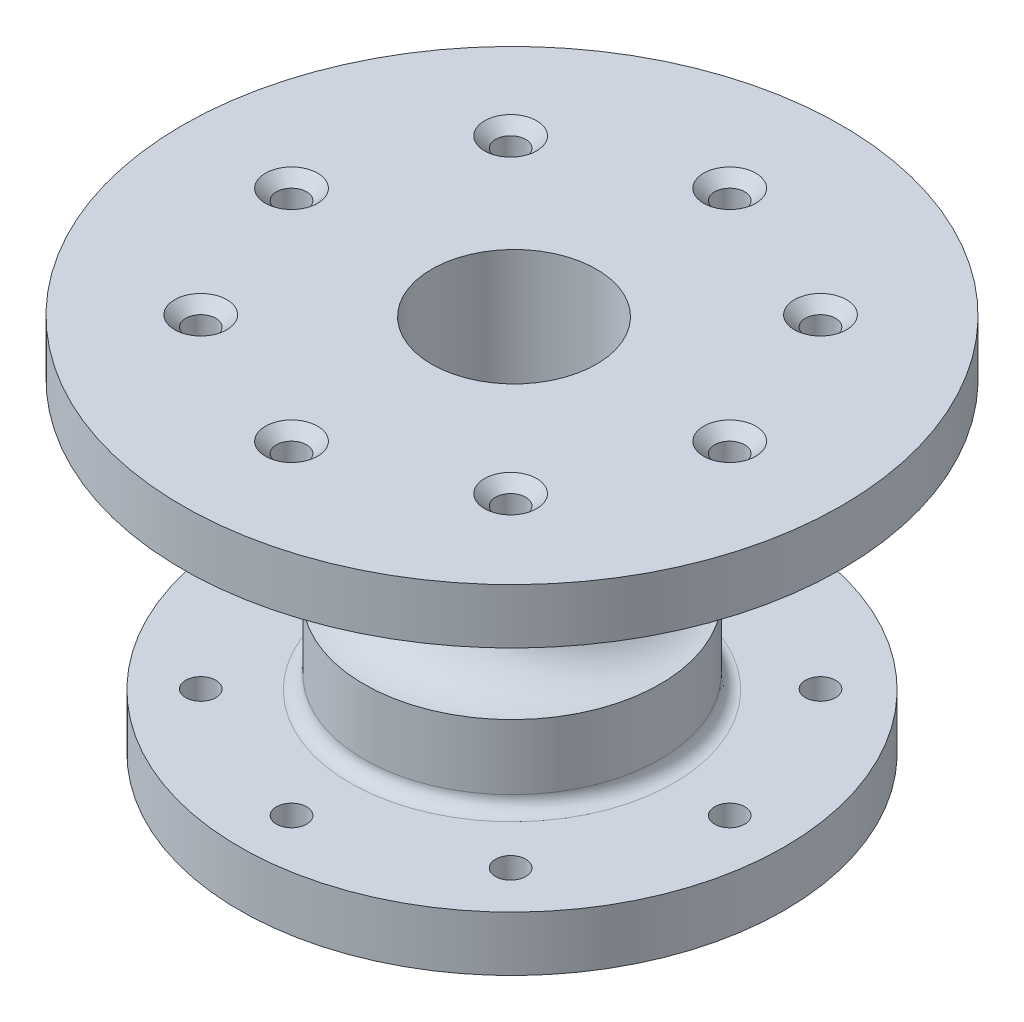
ISO-10303-21;
HEADER;
FILE_DESCRIPTION(('STEP AP214'),'2;1');
FILE_NAME('part.step','',(''),(''),'','','');
FILE_SCHEMA(('AUTOMOTIVE_DESIGN { 1 0 10303 214 1 1 1 1 }'));
ENDSEC;
DATA;
#1=APPLICATION_CONTEXT('core data for automotive mechanical design processes');
#2=APPLICATION_PROTOCOL_DEFINITION('international standard','automotive_design',2000,#1);
#3=PRODUCT_CONTEXT('',#1,'mechanical');
#4=PRODUCT('Part','Part','',(#3));
#5=PRODUCT_RELATED_PRODUCT_CATEGORY('part','',(#4));
#6=PRODUCT_DEFINITION_FORMATION('','',#4);
#7=PRODUCT_DEFINITION_CONTEXT('part definition',#1,'design');
#8=PRODUCT_DEFINITION('design','',#6,#7);
#9=PRODUCT_DEFINITION_SHAPE('','',#8);
#10=(LENGTH_UNIT() NAMED_UNIT(*) SI_UNIT(.MILLI.,.METRE.));
#11=(NAMED_UNIT(*) PLANE_ANGLE_UNIT() SI_UNIT($,.RADIAN.));
#12=(NAMED_UNIT(*) SI_UNIT($,.STERADIAN.) SOLID_ANGLE_UNIT());
#13=UNCERTAINTY_MEASURE_WITH_UNIT(LENGTH_MEASURE(1.E-05),#10,'distance_accuracy_value','');
#14=(GEOMETRIC_REPRESENTATION_CONTEXT(3) GLOBAL_UNCERTAINTY_ASSIGNED_CONTEXT((#13)) GLOBAL_UNIT_ASSIGNED_CONTEXT((#10,
#11,#12)) REPRESENTATION_CONTEXT('',''));
#15=CARTESIAN_POINT('',(0.,0.,0.));
#16=DIRECTION('',(0.,0.,1.));
#17=DIRECTION('',(1.,0.,0.));
#18=AXIS2_PLACEMENT_3D('',#15,#16,#17);
#19=CARTESIAN_POINT('',(-0.742985442059328,-44.003557410466,0.));
#20=DIRECTION('',(0.,1.,0.));
#21=DIRECTION('',(-1.,0.,0.));
#22=AXIS2_PLACEMENT_3D('',#19,#20,#21);
#23=TOROIDAL_SURFACE('',#22,58.8888888888888,5.);
#24=CARTESIAN_POINT('',(-0.742985442059325,-44.003557410466,0.));
#25=DIRECTION('',(0.,1.,0.));
#26=DIRECTION('',(-1.,0.,0.));
#27=AXIS2_PLACEMENT_3D('',#24,#25,#26);
#28=CIRCLE('',#27,53.8888888888889);
#29=CARTESIAN_POINT('',(-54.6318743309482,-44.003557410466,0.));
#30=VERTEX_POINT('',#29);
#31=EDGE_CURVE('E10',#30,#30,#28,.T.);
#32=ORIENTED_EDGE('',*,*,#31,.F.);
#33=EDGE_LOOP('',(#32));
#34=FACE_BOUND('',#33,.T.);
#35=CARTESIAN_POINT('',(-0.742985442059325,-49.003557410466,0.));
#36=DIRECTION('',(0.,1.,0.));
#37=DIRECTION('',(-1.,0.,0.));
#38=AXIS2_PLACEMENT_3D('',#35,#36,#37);
#39=CIRCLE('',#38,58.8888888888888);
#40=CARTESIAN_POINT('',(-59.6318743309482,-49.003557410466,0.));
#41=VERTEX_POINT('',#40);
#42=EDGE_CURVE('E90',#41,#41,#39,.T.);
#43=ORIENTED_EDGE('',*,*,#42,.T.);
#44=EDGE_LOOP('',(#43));
#45=FACE_BOUND('',#44,.T.);
#46=ADVANCED_FACE('F47',(#34,#45),#23,.F.);
#47=CARTESIAN_POINT('',(-0.742985442059307,69.003557410466,0.));
#48=DIRECTION('',(0.,1.,0.));
#49=DIRECTION('',(-1.,0.,0.));
#50=AXIS2_PLACEMENT_3D('',#47,#48,#49);
#51=CYLINDRICAL_SURFACE('',#50,53.8888888888889);
#52=CARTESIAN_POINT('',(-0.742985442059321,-20.3214611920219,0.));
#53=DIRECTION('',(0.,1.,0.));
#54=DIRECTION('',(-1.,0.,0.));
#55=AXIS2_PLACEMENT_3D('',#52,#53,#54);
#56=CIRCLE('',#55,53.8888888888889);
#57=CARTESIAN_POINT('',(-54.6318743309482,-20.3214611920219,0.));
#58=VERTEX_POINT('',#57);
#59=EDGE_CURVE('E54',#58,#58,#56,.T.);
#60=ORIENTED_EDGE('',*,*,#59,.F.);
#61=EDGE_LOOP('',(#60));
#62=FACE_BOUND('',#61,.T.);
#63=ORIENTED_EDGE('',*,*,#31,.T.);
#64=EDGE_LOOP('',(#63));
#65=FACE_BOUND('',#64,.T.);
#66=ADVANCED_FACE('F322',(#62,#65),#51,.T.);
#67=CARTESIAN_POINT('',(-0.742985442059321,-0.321461192021893,0.));
#68=DIRECTION('',(0.,1.,0.));
#69=DIRECTION('',(-1.,0.,0.));
#70=AXIS2_PLACEMENT_3D('',#67,#68,#69);
#71=TOROIDAL_SURFACE('',#70,53.8888888888889,20.);
#72=CARTESIAN_POINT('',(-0.742985442059315,19.6785388079781,0.));
#73=DIRECTION('',(0.,1.,0.));
#74=DIRECTION('',(-1.,0.,0.));
#75=AXIS2_PLACEMENT_3D('',#72,#73,#74);
#76=CIRCLE('',#75,53.8888888888889);
#77=CARTESIAN_POINT('',(-54.6318743309482,19.6785388079781,0.));
#78=VERTEX_POINT('',#77);
#79=EDGE_CURVE('E59',#78,#78,#76,.T.);
#80=ORIENTED_EDGE('',*,*,#79,.F.);
#81=EDGE_LOOP('',(#80));
#82=FACE_BOUND('',#81,.T.);
#83=ORIENTED_EDGE('',*,*,#59,.T.);
#84=EDGE_LOOP('',(#83));
#85=FACE_BOUND('',#84,.T.);
#86=ADVANCED_FACE('F317',(#82,#85),#71,.F.);
#87=CARTESIAN_POINT('',(-0.742985442059307,69.003557410466,0.));
#88=DIRECTION('',(0.,1.,0.));
#89=DIRECTION('',(-1.,0.,0.));
#90=AXIS2_PLACEMENT_3D('',#87,#88,#89);
#91=CYLINDRICAL_SURFACE('',#90,53.8888888888888);
#92=CARTESIAN_POINT('',(-0.742985442059311,44.003557410466,0.));
#93=DIRECTION('',(0.,1.,0.));
#94=DIRECTION('',(-1.,0.,0.));
#95=AXIS2_PLACEMENT_3D('',#92,#93,#94);
#96=CIRCLE('',#95,53.8888888888888);
#97=CARTESIAN_POINT('',(-54.6318743309482,44.0035574104661,0.));
#98=VERTEX_POINT('',#97);
#99=EDGE_CURVE('E64',#98,#98,#96,.T.);
#100=ORIENTED_EDGE('',*,*,#99,.F.);
#101=EDGE_LOOP('',(#100));
#102=FACE_BOUND('',#101,.T.);
#103=ORIENTED_EDGE('',*,*,#79,.T.);
#104=EDGE_LOOP('',(#103));
#105=FACE_BOUND('',#104,.T.);
#106=ADVANCED_FACE('F311',(#102,#105),#91,.T.);
#107=CARTESIAN_POINT('',(-0.742985442059314,44.0035574104661,0.));
#108=DIRECTION('',(0.,1.,0.));
#109=DIRECTION('',(-1.,0.,0.));
#110=AXIS2_PLACEMENT_3D('',#107,#108,#109);
#111=TOROIDAL_SURFACE('',#110,58.8888888888888,5.);
#112=CARTESIAN_POINT('',(-0.74298544205931,49.0035574104661,0.));
#113=DIRECTION('',(0.,1.,0.));
#114=DIRECTION('',(-1.,0.,0.));
#115=AXIS2_PLACEMENT_3D('',#112,#113,#114);
#116=CIRCLE('',#115,58.8888888888888);
#117=CARTESIAN_POINT('',(-59.6318743309481,49.0035574104661,0.));
#118=VERTEX_POINT('',#117);
#119=EDGE_CURVE('E70',#118,#118,#116,.T.);
#120=ORIENTED_EDGE('',*,*,#119,.F.);
#121=EDGE_LOOP('',(#120));
#122=FACE_BOUND('',#121,.T.);
#123=ORIENTED_EDGE('',*,*,#99,.T.);
#124=EDGE_LOOP('',(#123));
#125=FACE_BOUND('',#124,.T.);
#126=ADVANCED_FACE('F304',(#122,#125),#111,.F.);
#127=CARTESIAN_POINT('',(119.257014557941,49.003557410466,0.));
#128=DIRECTION('',(0.,1.,0.));
#129=DIRECTION('',(-1.,0.,0.));
#130=AXIS2_PLACEMENT_3D('',#127,#128,#129);
#131=PLANE('',#130);
#132=CARTESIAN_POINT('',(-1.24297699976672,49.0035574104661,-79.7770463266747));
#133=DIRECTION('',(0.,1.,0.));
#134=DIRECTION('',(0.,0.,1.));
#135=AXIS2_PLACEMENT_3D('',#132,#133,#134);
#136=CIRCLE('',#135,5.49999999999998);
#137=CARTESIAN_POINT('',(-1.2429769997667,49.0035574104661,-74.2770463266747));
#138=VERTEX_POINT('',#137);
#139=EDGE_CURVE('E168',#138,#138,#136,.T.);
#140=ORIENTED_EDGE('',*,*,#139,.T.);
#141=EDGE_LOOP('',(#140));
#142=FACE_BOUND('',#141,.T.);
#143=CARTESIAN_POINT('',(-57.6538674403918,49.0035574104661,-56.4108904406247));
#144=DIRECTION('',(0.,1.,0.));
#145=DIRECTION('',(0.707106781186551,0.,0.707106781186544));
#146=AXIS2_PLACEMENT_3D('',#143,#144,#145);
#147=CIRCLE('',#146,5.49999999999998);
#148=CARTESIAN_POINT('',(-53.7647801438658,49.0035574104661,-52.5218031440988));
#149=VERTEX_POINT('',#148);
#150=EDGE_CURVE('E158',#149,#149,#147,.T.);
#151=ORIENTED_EDGE('',*,*,#150,.T.);
#152=EDGE_LOOP('',(#151));
#153=FACE_BOUND('',#152,.T.);
#154=CARTESIAN_POINT('',(-81.0200233264412,49.0035574104661,0.));
#155=DIRECTION('',(0.,1.,0.));
#156=DIRECTION('',(1.,0.,0.));
#157=AXIS2_PLACEMENT_3D('',#154,#155,#156);
#158=CIRCLE('',#157,5.49999999999998);
#159=CARTESIAN_POINT('',(-75.5200233264412,49.0035574104661,0.));
#160=VERTEX_POINT('',#159);
#161=EDGE_CURVE('E146',#160,#160,#158,.T.);
#162=ORIENTED_EDGE('',*,*,#161,.T.);
#163=EDGE_LOOP('',(#162));
#164=FACE_BOUND('',#163,.T.);
#165=CARTESIAN_POINT('',(-57.653867440391,49.0035574104661,56.4108904406255));
#166=DIRECTION('',(0.,1.,0.));
#167=DIRECTION('',(0.707106781186541,0.,-0.707106781186554));
#168=AXIS2_PLACEMENT_3D('',#165,#166,#167);
#169=CIRCLE('',#168,5.49999999999998);
#170=CARTESIAN_POINT('',(-53.764780143865,49.0035574104661,52.5218031440995));
#171=VERTEX_POINT('',#170);
#172=EDGE_CURVE('E132',#171,#171,#169,.T.);
#173=ORIENTED_EDGE('',*,*,#172,.T.);
#174=EDGE_LOOP('',(#173));
#175=FACE_BOUND('',#174,.T.);
#176=CARTESIAN_POINT('',(-1.24297699976561,49.0035574104661,79.7770463266747));
#177=DIRECTION('',(0.,1.,0.));
#178=DIRECTION('',(0.,0.,-1.));
#179=AXIS2_PLACEMENT_3D('',#176,#177,#178);
#180=CIRCLE('',#179,5.49999999999998);
#181=CARTESIAN_POINT('',(-1.24297699976567,49.0035574104661,74.2770463266747));
#182=VERTEX_POINT('',#181);
#183=EDGE_CURVE('E192',#182,#182,#180,.T.);
#184=ORIENTED_EDGE('',*,*,#183,.T.);
#185=EDGE_LOOP('',(#184));
#186=FACE_BOUND('',#185,.T.);
#187=CARTESIAN_POINT('',(55.1679134408593,49.003557410466,56.4108904406244));
#188=DIRECTION('',(0.,1.,0.));
#189=DIRECTION('',(-0.707106781186556,0.,-0.707106781186539));
#190=AXIS2_PLACEMENT_3D('',#187,#188,#189);
#191=CIRCLE('',#190,5.49999999999998);
#192=CARTESIAN_POINT('',(51.2788261443332,49.003557410466,52.5218031440984));
#193=VERTEX_POINT('',#192);
#194=EDGE_CURVE('E180',#193,#193,#191,.T.);
#195=ORIENTED_EDGE('',*,*,#194,.T.);
#196=EDGE_LOOP('',(#195));
#197=FACE_BOUND('',#196,.T.);
#198=CARTESIAN_POINT('',(55.1679134408585,49.003557410466,-56.4108904406251));
#199=DIRECTION('',(0.,1.,0.));
#200=DIRECTION('',(-0.707106781186546,0.,0.707106781186549));
#201=AXIS2_PLACEMENT_3D('',#198,#199,#200);
#202=CIRCLE('',#201,5.49999999999998);
#203=CARTESIAN_POINT('',(51.2788261443325,49.003557410466,-52.5218031440991));
#204=VERTEX_POINT('',#203);
#205=EDGE_CURVE('E118',#204,#204,#202,.T.);
#206=ORIENTED_EDGE('',*,*,#205,.T.);
#207=EDGE_LOOP('',(#206));
#208=FACE_BOUND('',#207,.T.);
#209=CARTESIAN_POINT('',(78.5340693269083,49.003557410466,0.));
#210=DIRECTION('',(0.,1.,0.));
#211=DIRECTION('',(-1.,0.,0.));
#212=AXIS2_PLACEMENT_3D('',#209,#210,#211);
#213=CIRCLE('',#212,5.49999999999998);
#214=CARTESIAN_POINT('',(73.0340693269083,49.003557410466,0.));
#215=VERTEX_POINT('',#214);
#216=EDGE_CURVE('E94',#215,#215,#213,.T.);
#217=ORIENTED_EDGE('',*,*,#216,.T.);
#218=EDGE_LOOP('',(#217));
#219=FACE_BOUND('',#218,.T.);
#220=CARTESIAN_POINT('',(-0.74298544205931,49.0035574104661,0.));
#221=DIRECTION('',(0.,1.,0.));
#222=DIRECTION('',(-1.,0.,0.));
#223=AXIS2_PLACEMENT_3D('',#220,#221,#222);
#224=CIRCLE('',#223,120.);
#225=CARTESIAN_POINT('',(-120.742985442059,49.0035574104661,0.));
#226=VERTEX_POINT('',#225);
#227=EDGE_CURVE('E74',#226,#226,#224,.T.);
#228=ORIENTED_EDGE('',*,*,#227,.F.);
#229=EDGE_LOOP('',(#228));
#230=FACE_BOUND('',#229,.T.);
#231=ORIENTED_EDGE('',*,*,#119,.T.);
#232=EDGE_LOOP('',(#231));
#233=FACE_BOUND('',#232,.T.);
#234=ADVANCED_FACE('F298',(#142,#153,#164,#175,#186,#197,#208,#219,#230,#233),#131,.F.);
#235=CARTESIAN_POINT('',(-0.742985442059307,69.003557410466,0.));
#236=DIRECTION('',(0.,1.,0.));
#237=DIRECTION('',(-1.,0.,0.));
#238=AXIS2_PLACEMENT_3D('',#235,#236,#237);
#239=CYLINDRICAL_SURFACE('',#238,120.);
#240=CARTESIAN_POINT('',(-0.742985442059307,69.0035574104661,0.));
#241=DIRECTION('',(0.,1.,0.));
#242=DIRECTION('',(-1.,0.,0.));
#243=AXIS2_PLACEMENT_3D('',#240,#241,#242);
#244=CIRCLE('',#243,120.);
#245=CARTESIAN_POINT('',(-120.742985442059,69.0035574104661,0.));
#246=VERTEX_POINT('',#245);
#247=EDGE_CURVE('E78',#246,#246,#244,.T.);
#248=ORIENTED_EDGE('',*,*,#247,.F.);
#249=EDGE_LOOP('',(#248));
#250=FACE_BOUND('',#249,.T.);
#251=ORIENTED_EDGE('',*,*,#227,.T.);
#252=EDGE_LOOP('',(#251));
#253=FACE_BOUND('',#252,.T.);
#254=ADVANCED_FACE('F276',(#250,#253),#239,.T.);
#255=CARTESIAN_POINT('',(-0.742985442059307,69.0035574104661,0.));
#256=DIRECTION('',(0.,-1.,0.));
#257=DIRECTION('',(1.,0.,0.));
#258=AXIS2_PLACEMENT_3D('',#255,#256,#257);
#259=PLANE('',#258);
#260=CARTESIAN_POINT('',(0.,69.0035574104661,0.));
#261=DIRECTION('',(0.,1.,0.));
#262=DIRECTION('',(0.,0.,1.));
#263=AXIS2_PLACEMENT_3D('',#260,#261,#262);
#264=CIRCLE('',#263,30.);
#265=CARTESIAN_POINT('',(0.,69.0035574104661,30.));
#266=VERTEX_POINT('',#265);
#267=EDGE_CURVE('E255',#266,#266,#264,.T.);
#268=ORIENTED_EDGE('',*,*,#267,.F.);
#269=EDGE_LOOP('',(#268));
#270=FACE_BOUND('',#269,.T.);
#271=CARTESIAN_POINT('',(-1.24297699976672,69.0035574104661,-79.7770463266747));
#272=DIRECTION('',(0.,1.,0.));
#273=DIRECTION('',(1.,0.,0.));
#274=AXIS2_PLACEMENT_3D('',#271,#272,#273);
#275=CIRCLE('',#274,9.49999999999999);
#276=CARTESIAN_POINT('',(8.25702300023327,69.0035574104661,-79.7770463266747));
#277=VERTEX_POINT('',#276);
#278=EDGE_CURVE('E157',#277,#277,#275,.T.);
#279=ORIENTED_EDGE('',*,*,#278,.F.);
#280=EDGE_LOOP('',(#279));
#281=FACE_BOUND('',#280,.T.);
#282=CARTESIAN_POINT('',(-57.6538674403918,69.0035574104661,-56.4108904406247));
#283=DIRECTION('',(0.,1.,0.));
#284=DIRECTION('',(0.707106781186544,0.,-0.707106781186551));
#285=AXIS2_PLACEMENT_3D('',#282,#283,#284);
#286=CIRCLE('',#285,9.49999999999999);
#287=CARTESIAN_POINT('',(-50.9363530191196,69.0035574104661,-63.128404861897));
#288=VERTEX_POINT('',#287);
#289=EDGE_CURVE('E145',#288,#288,#286,.T.);
#290=ORIENTED_EDGE('',*,*,#289,.F.);
#291=EDGE_LOOP('',(#290));
#292=FACE_BOUND('',#291,.T.);
#293=CARTESIAN_POINT('',(-81.0200233264411,69.0035574104661,0.));
#294=DIRECTION('',(0.,1.,0.));
#295=DIRECTION('',(0.,0.,-1.));
#296=AXIS2_PLACEMENT_3D('',#293,#294,#295);
#297=CIRCLE('',#296,9.49999999999999);
#298=CARTESIAN_POINT('',(-81.0200233264411,69.0035574104661,-9.49999999999999));
#299=VERTEX_POINT('',#298);
#300=EDGE_CURVE('E131',#299,#299,#297,.T.);
#301=ORIENTED_EDGE('',*,*,#300,.F.);
#302=EDGE_LOOP('',(#301));
#303=FACE_BOUND('',#302,.T.);
#304=CARTESIAN_POINT('',(-57.653867440391,69.0035574104661,56.4108904406255));
#305=DIRECTION('',(0.,1.,0.));
#306=DIRECTION('',(-0.707106781186554,0.,-0.707106781186541));
#307=AXIS2_PLACEMENT_3D('',#304,#305,#306);
#308=CIRCLE('',#307,9.49999999999999);
#309=CARTESIAN_POINT('',(-64.3713818616633,69.0035574104661,49.6933760193534));
#310=VERTEX_POINT('',#309);
#311=EDGE_CURVE('E136',#310,#310,#308,.T.);
#312=ORIENTED_EDGE('',*,*,#311,.F.);
#313=EDGE_LOOP('',(#312));
#314=FACE_BOUND('',#313,.T.);
#315=CARTESIAN_POINT('',(-1.24297699976561,69.0035574104661,79.7770463266747));
#316=DIRECTION('',(0.,1.,0.));
#317=DIRECTION('',(-1.,0.,0.));
#318=AXIS2_PLACEMENT_3D('',#315,#316,#317);
#319=CIRCLE('',#318,9.49999999999999);
#320=CARTESIAN_POINT('',(-10.7429769997656,69.0035574104661,79.7770463266748));
#321=VERTEX_POINT('',#320);
#322=EDGE_CURVE('E179',#321,#321,#319,.T.);
#323=ORIENTED_EDGE('',*,*,#322,.F.);
#324=EDGE_LOOP('',(#323));
#325=FACE_BOUND('',#324,.T.);
#326=CARTESIAN_POINT('',(55.1679134408593,69.0035574104661,56.4108904406244));
#327=DIRECTION('',(0.,1.,0.));
#328=DIRECTION('',(-0.707106781186539,0.,0.707106781186556));
#329=AXIS2_PLACEMENT_3D('',#326,#327,#328);
#330=CIRCLE('',#329,9.49999999999999);
#331=CARTESIAN_POINT('',(48.4503990195872,69.0035574104661,63.1284048618966));
#332=VERTEX_POINT('',#331);
#333=EDGE_CURVE('E184',#332,#332,#330,.T.);
#334=ORIENTED_EDGE('',*,*,#333,.F.);
#335=EDGE_LOOP('',(#334));
#336=FACE_BOUND('',#335,.T.);
#337=CARTESIAN_POINT('',(55.1679134408585,69.0035574104661,-56.4108904406251));
#338=DIRECTION('',(0.,1.,0.));
#339=DIRECTION('',(0.707106781186549,0.,0.707106781186546));
#340=AXIS2_PLACEMENT_3D('',#337,#338,#339);
#341=CIRCLE('',#340,9.49999999999999);
#342=CARTESIAN_POINT('',(61.8854278621307,69.0035574104661,-49.693376019353));
#343=VERTEX_POINT('',#342);
#344=EDGE_CURVE('E122',#343,#343,#341,.T.);
#345=ORIENTED_EDGE('',*,*,#344,.F.);
#346=EDGE_LOOP('',(#345));
#347=FACE_BOUND('',#346,.T.);
#348=CARTESIAN_POINT('',(78.5340693269083,69.0035574104661,0.));
#349=DIRECTION('',(0.,1.,0.));
#350=DIRECTION('',(0.,0.,1.));
#351=AXIS2_PLACEMENT_3D('',#348,#349,#350);
#352=CIRCLE('',#351,9.49999999999999);
#353=CARTESIAN_POINT('',(78.5340693269083,69.0035574104661,9.49999999999999));
#354=VERTEX_POINT('',#353);
#355=EDGE_CURVE('E110',#354,#354,#352,.T.);
#356=ORIENTED_EDGE('',*,*,#355,.F.);
#357=EDGE_LOOP('',(#356));
#358=FACE_BOUND('',#357,.T.);
#359=ORIENTED_EDGE('',*,*,#247,.T.);
#360=EDGE_LOOP('',(#359));
#361=FACE_BOUND('',#360,.T.);
#362=ADVANCED_FACE('F272',(#270,#281,#292,#303,#314,#325,#336,#347,#358,#361),#259,.F.);
#363=CARTESIAN_POINT('',(98.4236812246073,-69.0035574104661,0.));
#364=DIRECTION('',(0.,1.,0.));
#365=DIRECTION('',(-1.,0.,0.));
#366=AXIS2_PLACEMENT_3D('',#363,#364,#365);
#367=PLANE('',#366);
#368=CARTESIAN_POINT('',(-1.24297699976674,-69.003557410466,-79.7770463266747));
#369=DIRECTION('',(0.,1.,0.));
#370=DIRECTION('',(1.,0.,0.));
#371=AXIS2_PLACEMENT_3D('',#368,#369,#370);
#372=CIRCLE('',#371,5.49999999999996);
#373=CARTESIAN_POINT('',(4.25702300023322,-69.003557410466,-79.7770463266748));
#374=VERTEX_POINT('',#373);
#375=EDGE_CURVE('E229',#374,#374,#372,.T.);
#376=ORIENTED_EDGE('',*,*,#375,.T.);
#377=EDGE_LOOP('',(#376));
#378=FACE_BOUND('',#377,.T.);
#379=CARTESIAN_POINT('',(-57.6538674403918,-69.003557410466,-56.4108904406248));
#380=DIRECTION('',(0.,1.,0.));
#381=DIRECTION('',(0.707106781186544,0.,-0.707106781186551));
#382=AXIS2_PLACEMENT_3D('',#379,#380,#381);
#383=CIRCLE('',#382,5.49999999999996);
#384=CARTESIAN_POINT('',(-53.7647801438659,-69.003557410466,-60.2999777371508));
#385=VERTEX_POINT('',#384);
#386=EDGE_CURVE('E221',#385,#385,#383,.T.);
#387=ORIENTED_EDGE('',*,*,#386,.T.);
#388=EDGE_LOOP('',(#387));
#389=FACE_BOUND('',#388,.T.);
#390=CARTESIAN_POINT('',(-81.0200233264412,-69.003557410466,0.));
#391=DIRECTION('',(0.,1.,0.));
#392=DIRECTION('',(0.,0.,-1.));
#393=AXIS2_PLACEMENT_3D('',#390,#391,#392);
#394=CIRCLE('',#393,5.49999999999996);
#395=CARTESIAN_POINT('',(-81.0200233264412,-69.003557410466,-5.49999999999996));
#396=VERTEX_POINT('',#395);
#397=EDGE_CURVE('E211',#396,#396,#394,.T.);
#398=ORIENTED_EDGE('',*,*,#397,.T.);
#399=EDGE_LOOP('',(#398));
#400=FACE_BOUND('',#399,.T.);
#401=CARTESIAN_POINT('',(-57.653867440391,-69.003557410466,56.4108904406256));
#402=DIRECTION('',(0.,1.,0.));
#403=DIRECTION('',(-0.707106781186554,0.,-0.707106781186541));
#404=AXIS2_PLACEMENT_3D('',#401,#402,#403);
#405=CIRCLE('',#404,5.49999999999996);
#406=CARTESIAN_POINT('',(-61.5429547369171,-69.003557410466,52.5218031440996));
#407=VERTEX_POINT('',#406);
#408=EDGE_CURVE('E212',#407,#407,#405,.T.);
#409=ORIENTED_EDGE('',*,*,#408,.T.);
#410=EDGE_LOOP('',(#409));
#411=FACE_BOUND('',#410,.T.);
#412=CARTESIAN_POINT('',(-1.24297699976563,-69.003557410466,79.7770463266747));
#413=DIRECTION('',(0.,1.,0.));
#414=DIRECTION('',(-1.,0.,0.));
#415=AXIS2_PLACEMENT_3D('',#412,#413,#414);
#416=CIRCLE('',#415,5.49999999999996);
#417=CARTESIAN_POINT('',(-6.74297699976559,-69.003557410466,79.7770463266748));
#418=VERTEX_POINT('',#417);
#419=EDGE_CURVE('E243',#418,#418,#416,.T.);
#420=ORIENTED_EDGE('',*,*,#419,.T.);
#421=EDGE_LOOP('',(#420));
#422=FACE_BOUND('',#421,.T.);
#423=CARTESIAN_POINT('',(55.1679134408593,-69.003557410466,56.4108904406244));
#424=DIRECTION('',(0.,1.,0.));
#425=DIRECTION('',(-0.707106781186539,0.,0.707106781186556));
#426=AXIS2_PLACEMENT_3D('',#423,#424,#425);
#427=CIRCLE('',#426,5.49999999999996);
#428=CARTESIAN_POINT('',(51.2788261443334,-69.003557410466,60.2999777371504));
#429=VERTEX_POINT('',#428);
#430=EDGE_CURVE('E244',#429,#429,#427,.T.);
#431=ORIENTED_EDGE('',*,*,#430,.T.);
#432=EDGE_LOOP('',(#431));
#433=FACE_BOUND('',#432,.T.);
#434=CARTESIAN_POINT('',(55.1679134408585,-69.003557410466,-56.4108904406252));
#435=DIRECTION('',(0.,1.,0.));
#436=DIRECTION('',(0.707106781186549,0.,0.707106781186546));
#437=AXIS2_PLACEMENT_3D('',#434,#435,#436);
#438=CIRCLE('',#437,5.49999999999996);
#439=CARTESIAN_POINT('',(59.0570007373845,-69.003557410466,-52.5218031440992));
#440=VERTEX_POINT('',#439);
#441=EDGE_CURVE('E202',#440,#440,#438,.T.);
#442=ORIENTED_EDGE('',*,*,#441,.T.);
#443=EDGE_LOOP('',(#442));
#444=FACE_BOUND('',#443,.T.);
#445=CARTESIAN_POINT('',(78.5340693269083,-69.003557410466,0.));
#446=DIRECTION('',(0.,1.,0.));
#447=DIRECTION('',(0.,0.,1.));
#448=AXIS2_PLACEMENT_3D('',#445,#446,#447);
#449=CIRCLE('',#448,5.49999999999996);
#450=CARTESIAN_POINT('',(78.5340693269083,-69.003557410466,5.49999999999996));
#451=VERTEX_POINT('',#450);
#452=EDGE_CURVE('E102',#451,#451,#449,.T.);
#453=ORIENTED_EDGE('',*,*,#452,.T.);
#454=EDGE_LOOP('',(#453));
#455=FACE_BOUND('',#454,.T.);
#456=CARTESIAN_POINT('',(-0.742985442059329,-69.003557410466,0.));
#457=DIRECTION('',(0.,1.,0.));
#458=DIRECTION('',(-1.,0.,0.));
#459=AXIS2_PLACEMENT_3D('',#456,#457,#458);
#460=CIRCLE('',#459,99.1666666666667);
#461=CARTESIAN_POINT('',(-99.909652108726,-69.003557410466,0.));
#462=VERTEX_POINT('',#461);
#463=EDGE_CURVE('E82',#462,#462,#460,.T.);
#464=ORIENTED_EDGE('',*,*,#463,.F.);
#465=EDGE_LOOP('',(#464));
#466=FACE_BOUND('',#465,.T.);
#467=ADVANCED_FACE('F275',(#378,#389,#400,#411,#422,#433,#444,#455,#466),#367,.F.);
#468=CARTESIAN_POINT('',(-0.742985442059307,69.003557410466,0.));
#469=DIRECTION('',(0.,1.,0.));
#470=DIRECTION('',(-1.,0.,0.));
#471=AXIS2_PLACEMENT_3D('',#468,#469,#470);
#472=CYLINDRICAL_SURFACE('',#471,99.1666666666667);
#473=CARTESIAN_POINT('',(-0.742985442059325,-49.003557410466,0.));
#474=DIRECTION('',(0.,1.,0.));
#475=DIRECTION('',(-1.,0.,0.));
#476=AXIS2_PLACEMENT_3D('',#473,#474,#475);
#477=CIRCLE('',#476,99.1666666666667);
#478=CARTESIAN_POINT('',(-99.909652108726,-49.003557410466,0.));
#479=VERTEX_POINT('',#478);
#480=EDGE_CURVE('E86',#479,#479,#477,.T.);
#481=ORIENTED_EDGE('',*,*,#480,.F.);
#482=EDGE_LOOP('',(#481));
#483=FACE_BOUND('',#482,.T.);
#484=ORIENTED_EDGE('',*,*,#463,.T.);
#485=EDGE_LOOP('',(#484));
#486=FACE_BOUND('',#485,.T.);
#487=ADVANCED_FACE('F339',(#483,#486),#472,.T.);
#488=CARTESIAN_POINT('',(58.1459034468295,-49.003557410466,0.));
#489=DIRECTION('',(0.,-1.,0.));
#490=DIRECTION('',(1.,0.,0.));
#491=AXIS2_PLACEMENT_3D('',#488,#489,#490);
#492=PLANE('',#491);
#493=CARTESIAN_POINT('',(-1.24297699976674,-49.003557410466,-79.7770463266747));
#494=DIRECTION('',(0.,-1.,0.));
#495=DIRECTION('',(0.,0.,-1.));
#496=AXIS2_PLACEMENT_3D('',#493,#494,#495);
#497=CIRCLE('',#496,5.49999999999998);
#498=CARTESIAN_POINT('',(-1.24297699976676,-49.003557410466,-85.2770463266747));
#499=VERTEX_POINT('',#498);
#500=EDGE_CURVE('E206',#499,#499,#497,.T.);
#501=ORIENTED_EDGE('',*,*,#500,.T.);
#502=EDGE_LOOP('',(#501));
#503=FACE_BOUND('',#502,.T.);
#504=CARTESIAN_POINT('',(-57.6538674403918,-49.003557410466,-56.4108904406248));
#505=DIRECTION('',(0.,-1.,0.));
#506=DIRECTION('',(-0.707106781186551,0.,-0.707106781186544));
#507=AXIS2_PLACEMENT_3D('',#504,#505,#506);
#508=CIRCLE('',#507,5.49999999999998);
#509=CARTESIAN_POINT('',(-61.5429547369178,-49.003557410466,-60.2999777371507));
#510=VERTEX_POINT('',#509);
#511=EDGE_CURVE('E225',#510,#510,#508,.T.);
#512=ORIENTED_EDGE('',*,*,#511,.T.);
#513=EDGE_LOOP('',(#512));
#514=FACE_BOUND('',#513,.T.);
#515=CARTESIAN_POINT('',(-81.0200233264412,-49.003557410466,0.));
#516=DIRECTION('',(0.,-1.,0.));
#517=DIRECTION('',(-1.,0.,0.));
#518=AXIS2_PLACEMENT_3D('',#515,#516,#517);
#519=CIRCLE('',#518,5.49999999999998);
#520=CARTESIAN_POINT('',(-86.5200233264412,-49.003557410466,0.));
#521=VERTEX_POINT('',#520);
#522=EDGE_CURVE('E217',#521,#521,#519,.T.);
#523=ORIENTED_EDGE('',*,*,#522,.T.);
#524=EDGE_LOOP('',(#523));
#525=FACE_BOUND('',#524,.T.);
#526=CARTESIAN_POINT('',(-57.653867440391,-49.003557410466,56.4108904406256));
#527=DIRECTION('',(0.,-1.,0.));
#528=DIRECTION('',(-0.707106781186541,0.,0.707106781186554));
#529=AXIS2_PLACEMENT_3D('',#526,#527,#528);
#530=CIRCLE('',#529,5.49999999999998);
#531=CARTESIAN_POINT('',(-61.542954736917,-49.003557410466,60.2999777371516));
#532=VERTEX_POINT('',#531);
#533=EDGE_CURVE('E207',#532,#532,#530,.T.);
#534=ORIENTED_EDGE('',*,*,#533,.T.);
#535=EDGE_LOOP('',(#534));
#536=FACE_BOUND('',#535,.T.);
#537=CARTESIAN_POINT('',(-1.24297699976562,-49.003557410466,79.7770463266747));
#538=DIRECTION('',(0.,-1.,0.));
#539=DIRECTION('',(0.,0.,1.));
#540=AXIS2_PLACEMENT_3D('',#537,#538,#539);
#541=CIRCLE('',#540,5.49999999999998);
#542=CARTESIAN_POINT('',(-1.24297699976557,-49.003557410466,85.2770463266747));
#543=VERTEX_POINT('',#542);
#544=EDGE_CURVE('E216',#543,#543,#541,.T.);
#545=ORIENTED_EDGE('',*,*,#544,.T.);
#546=EDGE_LOOP('',(#545));
#547=FACE_BOUND('',#546,.T.);
#548=CARTESIAN_POINT('',(55.1679134408593,-49.003557410466,56.4108904406244));
#549=DIRECTION('',(0.,-1.,0.));
#550=DIRECTION('',(0.707106781186556,0.,0.707106781186539));
#551=AXIS2_PLACEMENT_3D('',#548,#549,#550);
#552=CIRCLE('',#551,5.49999999999998);
#553=CARTESIAN_POINT('',(59.0570007373853,-49.003557410466,60.2999777371503));
#554=VERTEX_POINT('',#553);
#555=EDGE_CURVE('E239',#554,#554,#552,.T.);
#556=ORIENTED_EDGE('',*,*,#555,.T.);
#557=EDGE_LOOP('',(#556));
#558=FACE_BOUND('',#557,.T.);
#559=CARTESIAN_POINT('',(55.1679134408585,-49.003557410466,-56.4108904406252));
#560=DIRECTION('',(0.,-1.,0.));
#561=DIRECTION('',(0.707106781186546,0.,-0.707106781186549));
#562=AXIS2_PLACEMENT_3D('',#559,#560,#561);
#563=CIRCLE('',#562,5.49999999999998);
#564=CARTESIAN_POINT('',(59.0570007373845,-49.003557410466,-60.2999777371512));
#565=VERTEX_POINT('',#564);
#566=EDGE_CURVE('E188',#565,#565,#563,.T.);
#567=ORIENTED_EDGE('',*,*,#566,.T.);
#568=EDGE_LOOP('',(#567));
#569=FACE_BOUND('',#568,.T.);
#570=CARTESIAN_POINT('',(78.5340693269083,-49.003557410466,0.));
#571=DIRECTION('',(0.,-1.,0.));
#572=DIRECTION('',(1.,0.,0.));
#573=AXIS2_PLACEMENT_3D('',#570,#571,#572);
#574=CIRCLE('',#573,5.49999999999998);
#575=CARTESIAN_POINT('',(84.0340693269083,-49.003557410466,0.));
#576=VERTEX_POINT('',#575);
#577=EDGE_CURVE('E98',#576,#576,#574,.T.);
#578=ORIENTED_EDGE('',*,*,#577,.T.);
#579=EDGE_LOOP('',(#578));
#580=FACE_BOUND('',#579,.T.);
#581=ORIENTED_EDGE('',*,*,#42,.F.);
#582=EDGE_LOOP('',(#581));
#583=FACE_BOUND('',#582,.T.);
#584=ORIENTED_EDGE('',*,*,#480,.T.);
#585=EDGE_LOOP('',(#584));
#586=FACE_BOUND('',#585,.T.);
#587=ADVANCED_FACE('F335',(#503,#514,#525,#536,#547,#558,#569,#580,#583,#586),#492,.F.);
#588=CARTESIAN_POINT('',(78.5340693269083,69.0035574104661,0.));
#589=DIRECTION('',(0.,1.,0.));
#590=DIRECTION('',(0.,0.,1.));
#591=AXIS2_PLACEMENT_3D('',#588,#589,#590);
#592=CYLINDRICAL_SURFACE('',#591,5.49999999999998);
#593=ORIENTED_EDGE('',*,*,#452,.F.);
#594=EDGE_LOOP('',(#593));
#595=FACE_BOUND('',#594,.T.);
#596=ORIENTED_EDGE('',*,*,#577,.F.);
#597=EDGE_LOOP('',(#596));
#598=FACE_BOUND('',#597,.T.);
#599=ADVANCED_FACE('F338',(#595,#598),#592,.F.);
#600=CARTESIAN_POINT('',(78.5340693269083,65.1408023112377,0.));
#601=DIRECTION('',(0.,1.,0.));
#602=DIRECTION('',(0.,0.,1.));
#603=AXIS2_PLACEMENT_3D('',#600,#601,#602);
#604=CIRCLE('',#603,5.50000000000001);
#605=CARTESIAN_POINT('',(78.5340693269083,65.1408023112377,5.50000000000001));
#606=VERTEX_POINT('',#605);
#607=EDGE_CURVE('E106',#606,#606,#604,.T.);
#608=ORIENTED_EDGE('',*,*,#607,.T.);
#609=EDGE_LOOP('',(#608));
#610=FACE_BOUND('',#609,.T.);
#611=ORIENTED_EDGE('',*,*,#216,.F.);
#612=EDGE_LOOP('',(#611));
#613=FACE_BOUND('',#612,.T.);
#614=ADVANCED_FACE('F356',(#610,#613),#592,.F.);
#615=CARTESIAN_POINT('',(78.5340693269083,69.0035574104661,0.));
#616=DIRECTION('',(0.,1.,0.));
#617=DIRECTION('',(0.,0.,1.));
#618=AXIS2_PLACEMENT_3D('',#615,#616,#617);
#619=CONICAL_SURFACE('',#618,9.49999999999999,0.80285145591739);
#620=ORIENTED_EDGE('',*,*,#607,.F.);
#621=EDGE_LOOP('',(#620));
#622=FACE_BOUND('',#621,.T.);
#623=ORIENTED_EDGE('',*,*,#355,.T.);
#624=EDGE_LOOP('',(#623));
#625=FACE_BOUND('',#624,.T.);
#626=ADVANCED_FACE('F359',(#622,#625),#619,.F.);
#627=CARTESIAN_POINT('',(55.1679134408585,69.0035574104661,-56.4108904406251));
#628=DIRECTION('',(0.,1.,0.));
#629=DIRECTION('',(0.707106781186549,0.,0.707106781186546));
#630=AXIS2_PLACEMENT_3D('',#627,#628,#629);
#631=CYLINDRICAL_SURFACE('',#630,5.49999999999998);
#632=CARTESIAN_POINT('',(55.1679134408585,65.1408023112377,-56.4108904406251));
#633=DIRECTION('',(0.,1.,0.));
#634=DIRECTION('',(0.707106781186549,0.,0.707106781186546));
#635=AXIS2_PLACEMENT_3D('',#632,#633,#634);
#636=CIRCLE('',#635,5.50000000000001);
#637=CARTESIAN_POINT('',(59.0570007373845,65.1408023112377,-52.5218031440991));
#638=VERTEX_POINT('',#637);
#639=EDGE_CURVE('E114',#638,#638,#636,.T.);
#640=ORIENTED_EDGE('',*,*,#639,.T.);
#641=EDGE_LOOP('',(#640));
#642=FACE_BOUND('',#641,.T.);
#643=ORIENTED_EDGE('',*,*,#205,.F.);
#644=EDGE_LOOP('',(#643));
#645=FACE_BOUND('',#644,.T.);
#646=ADVANCED_FACE('F363',(#642,#645),#631,.F.);
#647=CARTESIAN_POINT('',(55.1679134408585,69.0035574104661,-56.4108904406251));
#648=DIRECTION('',(0.,1.,0.));
#649=DIRECTION('',(0.707106781186549,0.,0.707106781186546));
#650=AXIS2_PLACEMENT_3D('',#647,#648,#649);
#651=CONICAL_SURFACE('',#650,9.49999999999999,0.80285145591739);
#652=ORIENTED_EDGE('',*,*,#639,.F.);
#653=EDGE_LOOP('',(#652));
#654=FACE_BOUND('',#653,.T.);
#655=ORIENTED_EDGE('',*,*,#344,.T.);
#656=EDGE_LOOP('',(#655));
#657=FACE_BOUND('',#656,.T.);
#658=ADVANCED_FACE('F367',(#654,#657),#651,.F.);
#659=CARTESIAN_POINT('',(55.1679134408593,69.0035574104661,56.4108904406244));
#660=DIRECTION('',(0.,1.,0.));
#661=DIRECTION('',(-0.707106781186539,0.,0.707106781186556));
#662=AXIS2_PLACEMENT_3D('',#659,#660,#661);
#663=CYLINDRICAL_SURFACE('',#662,5.49999999999998);
#664=CARTESIAN_POINT('',(55.1679134408593,65.1408023112377,56.4108904406244));
#665=DIRECTION('',(0.,1.,0.));
#666=DIRECTION('',(-0.707106781186539,0.,0.707106781186556));
#667=AXIS2_PLACEMENT_3D('',#664,#665,#666);
#668=CIRCLE('',#667,5.50000000000001);
#669=CARTESIAN_POINT('',(51.2788261443333,65.1408023112377,60.2999777371504));
#670=VERTEX_POINT('',#669);
#671=EDGE_CURVE('E175',#670,#670,#668,.T.);
#672=ORIENTED_EDGE('',*,*,#671,.T.);
#673=EDGE_LOOP('',(#672));
#674=FACE_BOUND('',#673,.T.);
#675=ORIENTED_EDGE('',*,*,#194,.F.);
#676=EDGE_LOOP('',(#675));
#677=FACE_BOUND('',#676,.T.);
#678=ADVANCED_FACE('F371',(#674,#677),#663,.F.);
#679=CARTESIAN_POINT('',(55.1679134408593,69.0035574104661,56.4108904406244));
#680=DIRECTION('',(0.,1.,0.));
#681=DIRECTION('',(-0.707106781186539,0.,0.707106781186556));
#682=AXIS2_PLACEMENT_3D('',#679,#680,#681);
#683=CONICAL_SURFACE('',#682,9.49999999999999,0.80285145591739);
#684=ORIENTED_EDGE('',*,*,#671,.F.);
#685=EDGE_LOOP('',(#684));
#686=FACE_BOUND('',#685,.T.);
#687=ORIENTED_EDGE('',*,*,#333,.T.);
#688=EDGE_LOOP('',(#687));
#689=FACE_BOUND('',#688,.T.);
#690=ADVANCED_FACE('F409',(#686,#689),#683,.F.);
#691=CARTESIAN_POINT('',(-1.24297699976561,69.0035574104661,79.7770463266747));
#692=DIRECTION('',(0.,1.,0.));
#693=DIRECTION('',(-1.,0.,0.));
#694=AXIS2_PLACEMENT_3D('',#691,#692,#693);
#695=CYLINDRICAL_SURFACE('',#694,5.49999999999998);
#696=CARTESIAN_POINT('',(-1.24297699976561,65.1408023112378,79.7770463266747));
#697=DIRECTION('',(0.,1.,0.));
#698=DIRECTION('',(-1.,0.,0.));
#699=AXIS2_PLACEMENT_3D('',#696,#697,#698);
#700=CIRCLE('',#699,5.50000000000001);
#701=CARTESIAN_POINT('',(-6.74297699976561,65.1408023112378,79.7770463266748));
#702=VERTEX_POINT('',#701);
#703=EDGE_CURVE('E140',#702,#702,#700,.T.);
#704=ORIENTED_EDGE('',*,*,#703,.T.);
#705=EDGE_LOOP('',(#704));
#706=FACE_BOUND('',#705,.T.);
#707=ORIENTED_EDGE('',*,*,#183,.F.);
#708=EDGE_LOOP('',(#707));
#709=FACE_BOUND('',#708,.T.);
#710=ADVANCED_FACE('F413',(#706,#709),#695,.F.);
#711=CARTESIAN_POINT('',(-1.24297699976561,69.0035574104661,79.7770463266747));
#712=DIRECTION('',(0.,1.,0.));
#713=DIRECTION('',(-1.,0.,0.));
#714=AXIS2_PLACEMENT_3D('',#711,#712,#713);
#715=CONICAL_SURFACE('',#714,9.49999999999999,0.80285145591739);
#716=ORIENTED_EDGE('',*,*,#703,.F.);
#717=EDGE_LOOP('',(#716));
#718=FACE_BOUND('',#717,.T.);
#719=ORIENTED_EDGE('',*,*,#322,.T.);
#720=EDGE_LOOP('',(#719));
#721=FACE_BOUND('',#720,.T.);
#722=ADVANCED_FACE('F377',(#718,#721),#715,.F.);
#723=CARTESIAN_POINT('',(-57.653867440391,69.0035574104661,56.4108904406255));
#724=DIRECTION('',(0.,1.,0.));
#725=DIRECTION('',(-0.707106781186554,0.,-0.707106781186541));
#726=AXIS2_PLACEMENT_3D('',#723,#724,#725);
#727=CYLINDRICAL_SURFACE('',#726,5.49999999999998);
#728=CARTESIAN_POINT('',(-57.653867440391,65.1408023112378,56.4108904406255));
#729=DIRECTION('',(0.,1.,0.));
#730=DIRECTION('',(-0.707106781186554,0.,-0.707106781186541));
#731=AXIS2_PLACEMENT_3D('',#728,#729,#730);
#732=CIRCLE('',#731,5.50000000000001);
#733=CARTESIAN_POINT('',(-61.542954736917,65.1408023112378,52.5218031440996));
#734=VERTEX_POINT('',#733);
#735=EDGE_CURVE('E127',#734,#734,#732,.T.);
#736=ORIENTED_EDGE('',*,*,#735,.T.);
#737=EDGE_LOOP('',(#736));
#738=FACE_BOUND('',#737,.T.);
#739=ORIENTED_EDGE('',*,*,#172,.F.);
#740=EDGE_LOOP('',(#739));
#741=FACE_BOUND('',#740,.T.);
#742=ADVANCED_FACE('F373',(#738,#741),#727,.F.);
#743=CARTESIAN_POINT('',(-57.653867440391,69.0035574104661,56.4108904406255));
#744=DIRECTION('',(0.,1.,0.));
#745=DIRECTION('',(-0.707106781186554,0.,-0.707106781186541));
#746=AXIS2_PLACEMENT_3D('',#743,#744,#745);
#747=CONICAL_SURFACE('',#746,9.49999999999999,0.80285145591739);
#748=ORIENTED_EDGE('',*,*,#735,.F.);
#749=EDGE_LOOP('',(#748));
#750=FACE_BOUND('',#749,.T.);
#751=ORIENTED_EDGE('',*,*,#311,.T.);
#752=EDGE_LOOP('',(#751));
#753=FACE_BOUND('',#752,.T.);
#754=ADVANCED_FACE('F376',(#750,#753),#747,.F.);
#755=CARTESIAN_POINT('',(-81.0200233264411,69.0035574104661,0.));
#756=DIRECTION('',(0.,1.,0.));
#757=DIRECTION('',(0.,0.,-1.));
#758=AXIS2_PLACEMENT_3D('',#755,#756,#757);
#759=CYLINDRICAL_SURFACE('',#758,5.49999999999998);
#760=CARTESIAN_POINT('',(-81.0200233264412,65.1408023112378,0.));
#761=DIRECTION('',(0.,1.,0.));
#762=DIRECTION('',(0.,0.,-1.));
#763=AXIS2_PLACEMENT_3D('',#760,#761,#762);
#764=CIRCLE('',#763,5.50000000000001);
#765=CARTESIAN_POINT('',(-81.0200233264412,65.1408023112378,-5.50000000000001));
#766=VERTEX_POINT('',#765);
#767=EDGE_CURVE('E141',#766,#766,#764,.T.);
#768=ORIENTED_EDGE('',*,*,#767,.T.);
#769=EDGE_LOOP('',(#768));
#770=FACE_BOUND('',#769,.T.);
#771=ORIENTED_EDGE('',*,*,#161,.F.);
#772=EDGE_LOOP('',(#771));
#773=FACE_BOUND('',#772,.T.);
#774=ADVANCED_FACE('F381',(#770,#773),#759,.F.);
#775=CARTESIAN_POINT('',(-81.0200233264411,69.0035574104661,0.));
#776=DIRECTION('',(0.,1.,0.));
#777=DIRECTION('',(0.,0.,-1.));
#778=AXIS2_PLACEMENT_3D('',#775,#776,#777);
#779=CONICAL_SURFACE('',#778,9.49999999999999,0.80285145591739);
#780=ORIENTED_EDGE('',*,*,#767,.F.);
#781=EDGE_LOOP('',(#780));
#782=FACE_BOUND('',#781,.T.);
#783=ORIENTED_EDGE('',*,*,#300,.T.);
#784=EDGE_LOOP('',(#783));
#785=FACE_BOUND('',#784,.T.);
#786=ADVANCED_FACE('F385',(#782,#785),#779,.F.);
#787=CARTESIAN_POINT('',(-57.6538674403918,69.0035574104661,-56.4108904406247));
#788=DIRECTION('',(0.,1.,0.));
#789=DIRECTION('',(0.707106781186544,0.,-0.707106781186551));
#790=AXIS2_PLACEMENT_3D('',#787,#788,#789);
#791=CYLINDRICAL_SURFACE('',#790,5.49999999999998);
#792=CARTESIAN_POINT('',(-57.6538674403918,65.1408023112378,-56.4108904406247));
#793=DIRECTION('',(0.,1.,0.));
#794=DIRECTION('',(0.707106781186544,0.,-0.707106781186551));
#795=AXIS2_PLACEMENT_3D('',#792,#793,#794);
#796=CIRCLE('',#795,5.50000000000001);
#797=CARTESIAN_POINT('',(-53.7647801438658,65.1408023112378,-60.2999777371508));
#798=VERTEX_POINT('',#797);
#799=EDGE_CURVE('E153',#798,#798,#796,.T.);
#800=ORIENTED_EDGE('',*,*,#799,.T.);
#801=EDGE_LOOP('',(#800));
#802=FACE_BOUND('',#801,.T.);
#803=ORIENTED_EDGE('',*,*,#150,.F.);
#804=EDGE_LOOP('',(#803));
#805=FACE_BOUND('',#804,.T.);
#806=ADVANCED_FACE('F389',(#802,#805),#791,.F.);
#807=CARTESIAN_POINT('',(-57.6538674403918,69.0035574104661,-56.4108904406247));
#808=DIRECTION('',(0.,1.,0.));
#809=DIRECTION('',(0.707106781186544,0.,-0.707106781186551));
#810=AXIS2_PLACEMENT_3D('',#807,#808,#809);
#811=CONICAL_SURFACE('',#810,9.49999999999999,0.80285145591739);
#812=ORIENTED_EDGE('',*,*,#799,.F.);
#813=EDGE_LOOP('',(#812));
#814=FACE_BOUND('',#813,.T.);
#815=ORIENTED_EDGE('',*,*,#289,.T.);
#816=EDGE_LOOP('',(#815));
#817=FACE_BOUND('',#816,.T.);
#818=ADVANCED_FACE('F393',(#814,#817),#811,.F.);
#819=CARTESIAN_POINT('',(-1.24297699976672,69.0035574104661,-79.7770463266747));
#820=DIRECTION('',(0.,1.,0.));
#821=DIRECTION('',(1.,0.,0.));
#822=AXIS2_PLACEMENT_3D('',#819,#820,#821);
#823=CYLINDRICAL_SURFACE('',#822,5.49999999999998);
#824=CARTESIAN_POINT('',(-1.24297699976672,65.1408023112378,-79.7770463266747));
#825=DIRECTION('',(0.,1.,0.));
#826=DIRECTION('',(1.,0.,0.));
#827=AXIS2_PLACEMENT_3D('',#824,#825,#826);
#828=CIRCLE('',#827,5.50000000000001);
#829=CARTESIAN_POINT('',(4.25702300023328,65.1408023112378,-79.7770463266747));
#830=VERTEX_POINT('',#829);
#831=EDGE_CURVE('E126',#830,#830,#828,.T.);
#832=ORIENTED_EDGE('',*,*,#831,.T.);
#833=EDGE_LOOP('',(#832));
#834=FACE_BOUND('',#833,.T.);
#835=ORIENTED_EDGE('',*,*,#139,.F.);
#836=EDGE_LOOP('',(#835));
#837=FACE_BOUND('',#836,.T.);
#838=ADVANCED_FACE('F397',(#834,#837),#823,.F.);
#839=CARTESIAN_POINT('',(-1.24297699976672,69.0035574104661,-79.7770463266747));
#840=DIRECTION('',(0.,1.,0.));
#841=DIRECTION('',(1.,0.,0.));
#842=AXIS2_PLACEMENT_3D('',#839,#840,#841);
#843=CONICAL_SURFACE('',#842,9.49999999999999,0.80285145591739);
#844=ORIENTED_EDGE('',*,*,#831,.F.);
#845=EDGE_LOOP('',(#844));
#846=FACE_BOUND('',#845,.T.);
#847=ORIENTED_EDGE('',*,*,#278,.T.);
#848=EDGE_LOOP('',(#847));
#849=FACE_BOUND('',#848,.T.);
#850=ADVANCED_FACE('F401',(#846,#849),#843,.F.);
#851=CARTESIAN_POINT('',(55.1679134408585,69.0035574104661,-56.4108904406251));
#852=DIRECTION('',(0.,1.,0.));
#853=DIRECTION('',(0.707106781186549,0.,0.707106781186546));
#854=AXIS2_PLACEMENT_3D('',#851,#852,#853);
#855=CYLINDRICAL_SURFACE('',#854,5.49999999999998);
#856=ORIENTED_EDGE('',*,*,#441,.F.);
#857=EDGE_LOOP('',(#856));
#858=FACE_BOUND('',#857,.T.);
#859=ORIENTED_EDGE('',*,*,#566,.F.);
#860=EDGE_LOOP('',(#859));
#861=FACE_BOUND('',#860,.T.);
#862=ADVANCED_FACE('F405',(#858,#861),#855,.F.);
#863=CARTESIAN_POINT('',(55.1679134408593,69.0035574104661,56.4108904406244));
#864=DIRECTION('',(0.,1.,0.));
#865=DIRECTION('',(-0.707106781186539,0.,0.707106781186556));
#866=AXIS2_PLACEMENT_3D('',#863,#864,#865);
#867=CYLINDRICAL_SURFACE('',#866,5.49999999999998);
#868=ORIENTED_EDGE('',*,*,#430,.F.);
#869=EDGE_LOOP('',(#868));
#870=FACE_BOUND('',#869,.T.);
#871=ORIENTED_EDGE('',*,*,#555,.F.);
#872=EDGE_LOOP('',(#871));
#873=FACE_BOUND('',#872,.T.);
#874=ADVANCED_FACE('F423',(#870,#873),#867,.F.);
#875=CARTESIAN_POINT('',(-1.24297699976561,69.0035574104661,79.7770463266747));
#876=DIRECTION('',(0.,1.,0.));
#877=DIRECTION('',(-1.,0.,0.));
#878=AXIS2_PLACEMENT_3D('',#875,#876,#877);
#879=CYLINDRICAL_SURFACE('',#878,5.49999999999998);
#880=ORIENTED_EDGE('',*,*,#419,.F.);
#881=EDGE_LOOP('',(#880));
#882=FACE_BOUND('',#881,.T.);
#883=ORIENTED_EDGE('',*,*,#544,.F.);
#884=EDGE_LOOP('',(#883));
#885=FACE_BOUND('',#884,.T.);
#886=ADVANCED_FACE('F429',(#882,#885),#879,.F.);
#887=CARTESIAN_POINT('',(-57.653867440391,69.0035574104661,56.4108904406255));
#888=DIRECTION('',(0.,1.,0.));
#889=DIRECTION('',(-0.707106781186554,0.,-0.707106781186541));
#890=AXIS2_PLACEMENT_3D('',#887,#888,#889);
#891=CYLINDRICAL_SURFACE('',#890,5.49999999999998);
#892=ORIENTED_EDGE('',*,*,#408,.F.);
#893=EDGE_LOOP('',(#892));
#894=FACE_BOUND('',#893,.T.);
#895=ORIENTED_EDGE('',*,*,#533,.F.);
#896=EDGE_LOOP('',(#895));
#897=FACE_BOUND('',#896,.T.);
#898=ADVANCED_FACE('F425',(#894,#897),#891,.F.);
#899=CARTESIAN_POINT('',(-81.0200233264411,69.0035574104661,0.));
#900=DIRECTION('',(0.,1.,0.));
#901=DIRECTION('',(0.,0.,-1.));
#902=AXIS2_PLACEMENT_3D('',#899,#900,#901);
#903=CYLINDRICAL_SURFACE('',#902,5.49999999999998);
#904=ORIENTED_EDGE('',*,*,#397,.F.);
#905=EDGE_LOOP('',(#904));
#906=FACE_BOUND('',#905,.T.);
#907=ORIENTED_EDGE('',*,*,#522,.F.);
#908=EDGE_LOOP('',(#907));
#909=FACE_BOUND('',#908,.T.);
#910=ADVANCED_FACE('F428',(#906,#909),#903,.F.);
#911=CARTESIAN_POINT('',(-57.6538674403918,69.0035574104661,-56.4108904406247));
#912=DIRECTION('',(0.,1.,0.));
#913=DIRECTION('',(0.707106781186544,0.,-0.707106781186551));
#914=AXIS2_PLACEMENT_3D('',#911,#912,#913);
#915=CYLINDRICAL_SURFACE('',#914,5.49999999999998);
#916=ORIENTED_EDGE('',*,*,#386,.F.);
#917=EDGE_LOOP('',(#916));
#918=FACE_BOUND('',#917,.T.);
#919=ORIENTED_EDGE('',*,*,#511,.F.);
#920=EDGE_LOOP('',(#919));
#921=FACE_BOUND('',#920,.T.);
#922=ADVANCED_FACE('F433',(#918,#921),#915,.F.);
#923=CARTESIAN_POINT('',(-1.24297699976672,69.0035574104661,-79.7770463266747));
#924=DIRECTION('',(0.,1.,0.));
#925=DIRECTION('',(1.,0.,0.));
#926=AXIS2_PLACEMENT_3D('',#923,#924,#925);
#927=CYLINDRICAL_SURFACE('',#926,5.49999999999998);
#928=ORIENTED_EDGE('',*,*,#375,.F.);
#929=EDGE_LOOP('',(#928));
#930=FACE_BOUND('',#929,.T.);
#931=ORIENTED_EDGE('',*,*,#500,.F.);
#932=EDGE_LOOP('',(#931));
#933=FACE_BOUND('',#932,.T.);
#934=ADVANCED_FACE('F268',(#930,#933),#927,.F.);
#935=CARTESIAN_POINT('',(0.,-18.996442589534,0.));
#936=DIRECTION('',(0.,1.,0.));
#937=DIRECTION('',(0.,0.,1.));
#938=AXIS2_PLACEMENT_3D('',#935,#936,#937);
#939=CYLINDRICAL_SURFACE('',#938,30.);
#940=CARTESIAN_POINT('',(0.,-18.996442589534,0.));
#941=DIRECTION('',(0.,1.,0.));
#942=DIRECTION('',(0.,0.,1.));
#943=AXIS2_PLACEMENT_3D('',#940,#941,#942);
#944=CIRCLE('',#943,30.);
#945=CARTESIAN_POINT('',(0.,-18.996442589534,30.));
#946=VERTEX_POINT('',#945);
#947=EDGE_CURVE('E248',#946,#946,#944,.T.);
#948=ORIENTED_EDGE('',*,*,#947,.F.);
#949=EDGE_LOOP('',(#948));
#950=FACE_BOUND('',#949,.T.);
#951=ORIENTED_EDGE('',*,*,#267,.T.);
#952=EDGE_LOOP('',(#951));
#953=FACE_BOUND('',#952,.T.);
#954=ADVANCED_FACE('F265',(#950,#953),#939,.F.);
#955=CARTESIAN_POINT('',(0.,-18.996442589534,0.));
#956=DIRECTION('',(0.,1.,0.));
#957=DIRECTION('',(0.,0.,1.));
#958=AXIS2_PLACEMENT_3D('',#955,#956,#957);
#959=PLANE('',#958);
#960=ORIENTED_EDGE('',*,*,#947,.T.);
#961=EDGE_LOOP('',(#960));
#962=FACE_BOUND('',#961,.T.);
#963=ADVANCED_FACE('F263',(#962),#959,.T.);
#964=CLOSED_SHELL('',(#46,#66,#86,#106,#126,#234,#254,#362,#467,#487,#587,#599,#614,#626,#646,
#658,#678,#690,#710,#722,#742,#754,#774,#786,#806,#818,#838,#850,#862,#874,#886,#898,#910,#922,
#934,#954,#963));
#965=MANIFOLD_SOLID_BREP('B2',#964);
#966=ADVANCED_BREP_SHAPE_REPRESENTATION('',(#18,#965),#14);
#967=SHAPE_DEFINITION_REPRESENTATION(#9,#966);
ENDSEC;
END-ISO-10303-21;
